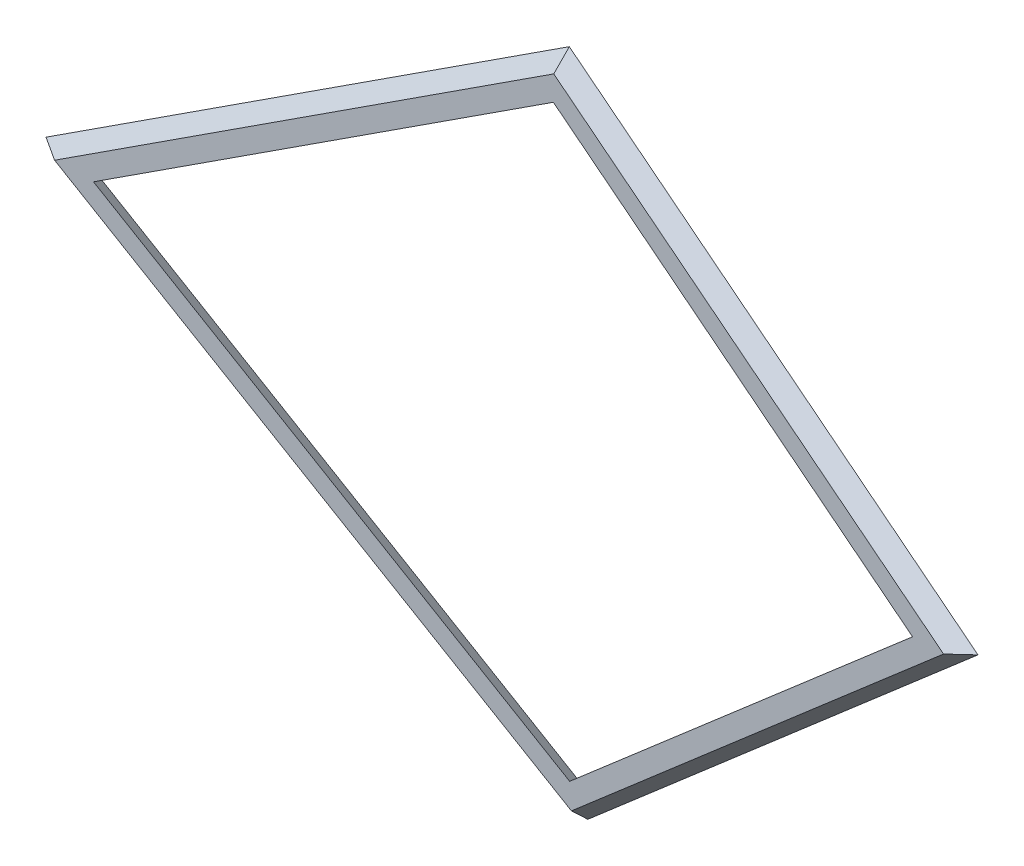
ISO-10303-21;
HEADER;
FILE_DESCRIPTION(('STEP AP214'),'2;1');
FILE_NAME('part.step','',(''),(''),'','','');
FILE_SCHEMA(('AUTOMOTIVE_DESIGN { 1 0 10303 214 1 1 1 1 }'));
ENDSEC;
DATA;
#1=APPLICATION_CONTEXT('core data for automotive mechanical design processes');
#2=APPLICATION_PROTOCOL_DEFINITION('international standard','automotive_design',2000,#1);
#3=PRODUCT_CONTEXT('',#1,'mechanical');
#4=PRODUCT('Part','Part','',(#3));
#5=PRODUCT_RELATED_PRODUCT_CATEGORY('part','',(#4));
#6=PRODUCT_DEFINITION_FORMATION('','',#4);
#7=PRODUCT_DEFINITION_CONTEXT('part definition',#1,'design');
#8=PRODUCT_DEFINITION('design','',#6,#7);
#9=PRODUCT_DEFINITION_SHAPE('','',#8);
#10=(LENGTH_UNIT() NAMED_UNIT(*) SI_UNIT(.MILLI.,.METRE.));
#11=(NAMED_UNIT(*) PLANE_ANGLE_UNIT() SI_UNIT($,.RADIAN.));
#12=(NAMED_UNIT(*) SI_UNIT($,.STERADIAN.) SOLID_ANGLE_UNIT());
#13=UNCERTAINTY_MEASURE_WITH_UNIT(LENGTH_MEASURE(1.E-05),#10,'distance_accuracy_value','');
#14=(GEOMETRIC_REPRESENTATION_CONTEXT(3) GLOBAL_UNCERTAINTY_ASSIGNED_CONTEXT((#13)) GLOBAL_UNIT_ASSIGNED_CONTEXT((#10,
#11,#12)) REPRESENTATION_CONTEXT('',''));
#15=CARTESIAN_POINT('',(0.,0.,0.));
#16=DIRECTION('',(0.,0.,1.));
#17=DIRECTION('',(1.,0.,0.));
#18=AXIS2_PLACEMENT_3D('',#15,#16,#17);
#19=CARTESIAN_POINT('',(1277.485311188,-1222.38433785116,1111.95299086095));
#20=DIRECTION('',(-8.3718556840685E-05,0.00879999570871307,-0.999961275783583));
#21=DIRECTION('',(-0.999819007396201,-0.0190248637440378,-8.37185568407934E-05));
#22=AXIS2_PLACEMENT_3D('',#19,#20,#21);
#23=PLANE('',#22);
#24=DIRECTION('',(-0.857927980202074,0.513749438132492,0.00459299520343572));
#25=VECTOR('',#24,1.);
#26=CARTESIAN_POINT('',(1253.50105292621,-1262.43334844979,1111.60255409664));
#27=LINE('',#26,#25);
#28=CARTESIAN_POINT('',(1278.33126123575,-1277.30231864556,1111.46962332588));
#29=VERTEX_POINT('',#28);
#30=CARTESIAN_POINT('',(1189.42018320766,-1224.06006820639,1111.94561684088));
#31=VERTEX_POINT('',#30);
#32=EDGE_CURVE('E279',#29,#31,#27,.T.);
#33=ORIENTED_EDGE('',*,*,#32,.T.);
#34=DIRECTION('',(0.837761664965984,0.546015542510236,0.00473498159186521));
#35=VECTOR('',#34,1.);
#36=CARTESIAN_POINT('',(1251.9947784496,-1183.27674880042,1112.29928491735));
#37=LINE('',#36,#35);
#38=CARTESIAN_POINT('',(1276.24133193064,-1167.47393087905,1112.43632506755));
#39=VERTEX_POINT('',#38);
#40=EDGE_CURVE('E48',#31,#39,#37,.T.);
#41=ORIENTED_EDGE('',*,*,#40,.T.);
#42=DIRECTION('',(0.780261658202363,-0.625428435214223,-0.0055693055929702));
#43=VECTOR('',#42,1.);
#44=CARTESIAN_POINT('',(1303.79693644232,-1189.56146834799,1112.2396403007));
#45=LINE('',#44,#43);
#46=CARTESIAN_POINT('',(1343.18588161485,-1221.13416717924,1111.95849221359));
#47=VERTEX_POINT('',#46);
#48=EDGE_CURVE('E11',#39,#47,#45,.T.);
#49=ORIENTED_EDGE('',*,*,#48,.T.);
#50=DIRECTION('',(-0.755902816253012,-0.654659045553444,-0.00569793434669476));
#51=VECTOR('',#50,1.);
#52=CARTESIAN_POINT('',(1305.02661251306,-1254.18247729538,1111.67085072664));
#53=LINE('',#52,#51);
#54=EDGE_CURVE('E62',#47,#29,#53,.T.);
#55=ORIENTED_EDGE('',*,*,#54,.T.);
#56=EDGE_LOOP('',(#33,#41,#49,#55));
#57=FACE_BOUND('',#56,.T.);
#58=DIRECTION('',(-0.755902816253012,-0.654659045553444,-0.00569793434669476));
#59=VECTOR('',#58,1.);
#60=CARTESIAN_POINT('',(1307.46839519862,-1257.00166675238,1111.64583648033));
#61=LINE('',#60,#59);
#62=CARTESIAN_POINT('',(1349.01082479404,-1221.02332836794,1111.95897995771));
#63=VERTEX_POINT('',#62);
#64=CARTESIAN_POINT('',(1278.61948575736,-1281.9866239638,1111.42837573216));
#65=VERTEX_POINT('',#64);
#66=EDGE_CURVE('E263',#63,#65,#61,.T.);
#67=ORIENTED_EDGE('',*,*,#66,.F.);
#68=DIRECTION('',(0.780261658202363,-0.625428435214223,-0.0055693055929702));
#69=VECTOR('',#68,1.);
#70=CARTESIAN_POINT('',(1306.12969734626,-1186.65142740631,1112.26505433727));
#71=LINE('',#70,#69);
#72=CARTESIAN_POINT('',(1276.35113661864,-1162.78205173852,1112.47760598974));
#73=VERTEX_POINT('',#72);
#74=EDGE_CURVE('E266',#73,#63,#71,.T.);
#75=ORIENTED_EDGE('',*,*,#74,.F.);
#76=DIRECTION('',(-0.837761664965984,-0.546015542510237,-0.00473498159186521));
#77=VECTOR('',#76,1.);
#78=CARTESIAN_POINT('',(1249.8811431059,-1180.03400831819,1112.32799908212));
#79=LINE('',#78,#77);
#80=CARTESIAN_POINT('',(1182.11795971329,-1224.19901716213,1111.9450053986));
#81=VERTEX_POINT('',#80);
#82=EDGE_CURVE('E275',#73,#81,#79,.T.);
#83=ORIENTED_EDGE('',*,*,#82,.T.);
#84=DIRECTION('',(-0.857927980202074,0.513749438132492,0.00459299520343572));
#85=VECTOR('',#84,1.);
#86=CARTESIAN_POINT('',(1251.51231552026,-1265.75415014311,1111.57349642498));
#87=LINE('',#86,#85);
#88=EDGE_CURVE('E43',#65,#81,#87,.T.);
#89=ORIENTED_EDGE('',*,*,#88,.F.);
#90=EDGE_LOOP('',(#67,#75,#83,#89));
#91=FACE_BOUND('',#90,.T.);
#92=ADVANCED_FACE('F40',(#57,#91),#23,.F.);
#93=CARTESIAN_POINT('',(1261.13154756589,-1249.89715249492,1134.67055685868));
#94=DIRECTION('',(0.398128734849398,0.670446346144006,-0.626095206361916));
#95=DIRECTION('',(-0.0131259517825785,0.68661310073075,0.726904504934937));
#96=AXIS2_PLACEMENT_3D('',#93,#94,#95);
#97=PLANE('',#96);
#98=DIRECTION('',(-0.0131259517825785,0.68661310073075,0.726904504934937));
#99=VECTOR('',#98,1.);
#100=CARTESIAN_POINT('',(1278.67411401633,-1284.84420556277,1108.4031073018));
#101=LINE('',#100,#99);
#102=CARTESIAN_POINT('',(1278.67411401633,-1284.84420556277,1108.4031073018));
#103=VERTEX_POINT('',#102);
#104=EDGE_CURVE('E225',#103,#65,#101,.T.);
#105=ORIENTED_EDGE('',*,*,#104,.T.);
#106=ORIENTED_EDGE('',*,*,#88,.T.);
#107=DIRECTION('',(0.838337489845591,0.0111553804106397,0.54503743963813));
#108=VECTOR('',#107,1.);
#109=CARTESIAN_POINT('',(1177.50315929271,-1224.26042423844,1108.94473517791));
#110=LINE('',#109,#108);
#111=CARTESIAN_POINT('',(1177.50315929271,-1224.26042423844,1108.94473517791));
#112=VERTEX_POINT('',#111);
#113=EDGE_CURVE('E268',#112,#81,#110,.T.);
#114=ORIENTED_EDGE('',*,*,#113,.F.);
#115=DIRECTION('',(0.857927980202074,-0.513749438132492,-0.00459299520343571));
#116=VECTOR('',#115,1.);
#117=CARTESIAN_POINT('',(1278.67411401633,-1284.84420556277,1108.4031073018));
#118=LINE('',#117,#116);
#119=EDGE_CURVE('E198',#112,#103,#118,.T.);
#120=ORIENTED_EDGE('',*,*,#119,.T.);
#121=EDGE_LOOP('',(#105,#106,#114,#120));
#122=FACE_BOUND('',#121,.T.);
#123=ADVANCED_FACE('F234',(#122),#97,.F.);
#124=CARTESIAN_POINT('',(1297.82411249905,-1246.04034324945,1131.69009532328));
#125=DIRECTION('',(-0.526645652021521,0.613216168553052,-0.588736178463615));
#126=DIRECTION('',(-0.0131259517825785,0.68661310073075,0.726904504934937));
#127=AXIS2_PLACEMENT_3D('',#124,#125,#126);
#128=PLANE('',#127);
#129=DIRECTION('',(-0.755497478815554,-0.0201402677605156,0.654841911546502));
#130=VECTOR('',#129,1.);
#131=CARTESIAN_POINT('',(1352.47148558704,-1220.93107308323,1108.95938592536));
#132=LINE('',#131,#130);
#133=CARTESIAN_POINT('',(1352.47148558704,-1220.93107308323,1108.95938592536));
#134=VERTEX_POINT('',#133);
#135=EDGE_CURVE('E228',#134,#63,#132,.T.);
#136=ORIENTED_EDGE('',*,*,#135,.T.);
#137=ORIENTED_EDGE('',*,*,#66,.T.);
#138=ORIENTED_EDGE('',*,*,#104,.F.);
#139=DIRECTION('',(0.755902816253012,0.654659045553444,0.00569793434669476));
#140=VECTOR('',#139,1.);
#141=CARTESIAN_POINT('',(1352.47148558704,-1220.93107308323,1108.95938592536));
#142=LINE('',#141,#140);
#143=EDGE_CURVE('E135',#103,#134,#142,.T.);
#144=ORIENTED_EDGE('',*,*,#143,.T.);
#145=EDGE_LOOP('',(#136,#137,#138,#144));
#146=FACE_BOUND('',#145,.T.);
#147=ADVANCED_FACE('F158',(#146),#128,.F.);
#148=CARTESIAN_POINT('',(1262.32593377044,-1247.88581345649,1132.7922712396));
#149=DIRECTION('',(0.398128734849398,0.670446346144006,-0.626095206361916));
#150=DIRECTION('',(-0.0131259517825785,0.68661310073075,0.726904504934937));
#151=AXIS2_PLACEMENT_3D('',#148,#149,#150);
#152=PLANE('',#151);
#153=ORIENTED_EDGE('',*,*,#32,.F.);
#154=DIRECTION('',(-0.0131259517825785,0.68661310073075,0.726904504934937));
#155=VECTOR('',#154,1.);
#156=CARTESIAN_POINT('',(1277.85994280457,-1252.64784673927,1137.57085366419));
#157=LINE('',#156,#155);
#158=CARTESIAN_POINT('',(1278.38588949473,-1280.15990024453,1108.44435489552));
#159=VERTEX_POINT('',#158);
#160=EDGE_CURVE('E119',#159,#29,#157,.T.);
#161=ORIENTED_EDGE('',*,*,#160,.F.);
#162=DIRECTION('',(0.857927980202074,-0.513749438132492,-0.00459299520343572));
#163=VECTOR('',#162,1.);
#164=CARTESIAN_POINT('',(1252.24404391565,-1264.50548776711,1108.58430763529));
#165=LINE('',#164,#163);
#166=CARTESIAN_POINT('',(1184.80538278708,-1224.1214752827,1108.94534662019));
#167=VERTEX_POINT('',#166);
#168=EDGE_CURVE('E115',#167,#159,#165,.T.);
#169=ORIENTED_EDGE('',*,*,#168,.F.);
#170=DIRECTION('',(0.838337489845591,0.0111553804106396,0.54503743963813));
#171=VECTOR('',#170,1.);
#172=CARTESIAN_POINT('',(1249.96160177756,-1223.25447074364,1151.30606554929));
#173=LINE('',#172,#171);
#174=EDGE_CURVE('E110',#167,#31,#173,.T.);
#175=ORIENTED_EDGE('',*,*,#174,.T.);
#176=EDGE_LOOP('',(#153,#161,#169,#175));
#177=FACE_BOUND('',#176,.T.);
#178=ADVANCED_FACE('F155',(#177),#152,.T.);
#179=CARTESIAN_POINT('',(1296.24417554298,-1244.20069474379,1129.92388678789));
#180=DIRECTION('',(-0.526645652021521,0.613216168553052,-0.588736178463615));
#181=DIRECTION('',(-0.0131259517825785,0.68661310073075,0.726904504934937));
#182=AXIS2_PLACEMENT_3D('',#179,#180,#181);
#183=PLANE('',#182);
#184=ORIENTED_EDGE('',*,*,#54,.F.);
#185=DIRECTION('',(-0.755497478815554,-0.0201402677605156,0.654841911546502));
#186=VECTOR('',#185,1.);
#187=CARTESIAN_POINT('',(1307.15363819288,-1222.09472502474,1143.19012940813));
#188=LINE('',#187,#186);
#189=CARTESIAN_POINT('',(1346.64654240786,-1221.04191189454,1108.95889818125));
#190=VERTEX_POINT('',#189);
#191=EDGE_CURVE('E126',#190,#47,#188,.T.);
#192=ORIENTED_EDGE('',*,*,#191,.F.);
#193=DIRECTION('',(0.755902816253012,0.654659045553444,0.00569793434669476));
#194=VECTOR('',#193,1.);
#195=CARTESIAN_POINT('',(1306.477155745,-1255.83110935186,1108.65610459055));
#196=LINE('',#195,#194);
#197=EDGE_CURVE('E125',#159,#190,#196,.T.);
#198=ORIENTED_EDGE('',*,*,#197,.F.);
#199=ORIENTED_EDGE('',*,*,#160,.T.);
#200=EDGE_LOOP('',(#184,#192,#198,#199));
#201=FACE_BOUND('',#200,.T.);
#202=ADVANCED_FACE('F154',(#201),#183,.T.);
#203=CARTESIAN_POINT('',(1260.10436750991,-1195.9175613101,1135.14568142233));
#204=DIRECTION('',(-0.423135588697556,0.643694966935379,0.637662185737585));
#205=DIRECTION('',(0.0132466459904118,-0.69929975648642,0.714705797477562));
#206=AXIS2_PLACEMENT_3D('',#203,#204,#205);
#207=PLANE('',#206);
#208=ORIENTED_EDGE('',*,*,#82,.F.);
#209=DIRECTION('',(0.013246645990412,-0.69929975648642,0.714705797477562));
#210=VECTOR('',#209,1.);
#211=CARTESIAN_POINT('',(1276.29600604833,-1159.8716701653,1109.50310676539));
#212=LINE('',#211,#210);
#213=CARTESIAN_POINT('',(1276.29600604833,-1159.8716701653,1109.50310676539));
#214=VERTEX_POINT('',#213);
#215=EDGE_CURVE('E229',#214,#73,#212,.T.);
#216=ORIENTED_EDGE('',*,*,#215,.F.);
#217=DIRECTION('',(-0.837761664965984,-0.546015542510236,-0.00473498159186521));
#218=VECTOR('',#217,1.);
#219=CARTESIAN_POINT('',(1177.50315929271,-1224.26042423844,1108.94473517791));
#220=LINE('',#219,#218);
#221=EDGE_CURVE('E140',#214,#112,#220,.T.);
#222=ORIENTED_EDGE('',*,*,#221,.T.);
#223=ORIENTED_EDGE('',*,*,#113,.T.);
#224=EDGE_LOOP('',(#208,#216,#222,#223));
#225=FACE_BOUND('',#224,.T.);
#226=ADVANCED_FACE('F145',(#225),#207,.T.);
#227=CARTESIAN_POINT('',(1277.48506003233,-1222.35793786404,1108.9531070336));
#228=DIRECTION('',(8.37185568406849E-05,-0.00879999570871307,0.999961275783582));
#229=DIRECTION('',(0.999819007396201,0.0190248637440378,8.37185568407934E-05));
#230=AXIS2_PLACEMENT_3D('',#227,#228,#229);
#231=PLANE('',#230);
#232=ORIENTED_EDGE('',*,*,#168,.T.);
#233=ORIENTED_EDGE('',*,*,#197,.T.);
#234=DIRECTION('',(-0.780261658202363,0.625428435214223,0.0055693055929702));
#235=VECTOR('',#234,1.);
#236=CARTESIAN_POINT('',(1305.18270397173,-1187.80605656515,1109.25485631898));
#237=LINE('',#236,#235);
#238=CARTESIAN_POINT('',(1276.18620136033,-1164.56354930583,1109.46182584321));
#239=VERTEX_POINT('',#238);
#240=EDGE_CURVE('E116',#190,#239,#237,.T.);
#241=ORIENTED_EDGE('',*,*,#240,.T.);
#242=DIRECTION('',(-0.837761664965984,-0.546015542510236,-0.00473498159186521));
#243=VECTOR('',#242,1.);
#244=CARTESIAN_POINT('',(1250.65884174157,-1181.20113931976,1109.31754664909));
#245=LINE('',#244,#243);
#246=EDGE_CURVE('E106',#239,#167,#245,.T.);
#247=ORIENTED_EDGE('',*,*,#246,.T.);
#248=EDGE_LOOP('',(#232,#233,#241,#247));
#249=FACE_BOUND('',#248,.T.);
#250=ORIENTED_EDGE('',*,*,#143,.F.);
#251=ORIENTED_EDGE('',*,*,#119,.F.);
#252=ORIENTED_EDGE('',*,*,#221,.F.);
#253=DIRECTION('',(-0.780261658202363,0.625428435214223,0.0055693055929702));
#254=VECTOR('',#253,1.);
#255=CARTESIAN_POINT('',(1276.29600604833,-1159.8716701653,1109.50310676539));
#256=LINE('',#255,#254);
#257=EDGE_CURVE('E204',#134,#214,#256,.T.);
#258=ORIENTED_EDGE('',*,*,#257,.F.);
#259=EDGE_LOOP('',(#250,#251,#252,#258));
#260=FACE_BOUND('',#259,.T.);
#261=ADVANCED_FACE('F122',(#249,#260),#231,.F.);
#262=CARTESIAN_POINT('',(1296.916091357,-1198.3227013919,1132.11010264953));
#263=DIRECTION('',(-0.503133967434248,-0.622352137793649,-0.599611563762364));
#264=DIRECTION('',(-0.0132466459904118,0.69929975648642,-0.714705797477563));
#265=AXIS2_PLACEMENT_3D('',#262,#263,#264);
#266=PLANE('',#265);
#267=ORIENTED_EDGE('',*,*,#215,.T.);
#268=ORIENTED_EDGE('',*,*,#74,.T.);
#269=ORIENTED_EDGE('',*,*,#135,.F.);
#270=ORIENTED_EDGE('',*,*,#257,.T.);
#271=EDGE_LOOP('',(#267,#268,#269,#270));
#272=FACE_BOUND('',#271,.T.);
#273=ADVANCED_FACE('F162',(#272),#266,.F.);
#274=CARTESIAN_POINT('',(1261.373774276,-1197.84864621091,1133.23269486511));
#275=DIRECTION('',(0.423135588697556,-0.643694966935379,-0.637662185737585));
#276=DIRECTION('',(-0.0132466459904118,0.69929975648642,-0.714705797477562));
#277=AXIS2_PLACEMENT_3D('',#274,#275,#276);
#278=PLANE('',#277);
#279=ORIENTED_EDGE('',*,*,#40,.F.);
#280=ORIENTED_EDGE('',*,*,#174,.F.);
#281=ORIENTED_EDGE('',*,*,#246,.F.);
#282=DIRECTION('',(0.0132466459904121,-0.69929975648642,0.714705797477562));
#283=VECTOR('',#282,1.);
#284=CARTESIAN_POINT('',(1276.71698417363,-1192.58394725075,1138.09953188144));
#285=LINE('',#284,#283);
#286=EDGE_CURVE('E108',#239,#39,#285,.T.);
#287=ORIENTED_EDGE('',*,*,#286,.T.);
#288=EDGE_LOOP('',(#279,#280,#281,#287));
#289=FACE_BOUND('',#288,.T.);
#290=ADVANCED_FACE('F107',(#289),#278,.T.);
#291=CARTESIAN_POINT('',(1295.4066894547,-1200.18975780528,1130.31126795825));
#292=DIRECTION('',(-0.503133967434248,-0.622352137793649,-0.599611563762364));
#293=DIRECTION('',(-0.0132466459904118,0.69929975648642,-0.714705797477563));
#294=AXIS2_PLACEMENT_3D('',#291,#292,#293);
#295=PLANE('',#294);
#296=ORIENTED_EDGE('',*,*,#48,.F.);
#297=ORIENTED_EDGE('',*,*,#286,.F.);
#298=ORIENTED_EDGE('',*,*,#240,.F.);
#299=ORIENTED_EDGE('',*,*,#191,.T.);
#300=EDGE_LOOP('',(#296,#297,#298,#299));
#301=FACE_BOUND('',#300,.T.);
#302=ADVANCED_FACE('F118',(#301),#295,.T.);
#303=CLOSED_SHELL('',(#92,#123,#147,#178,#202,#226,#261,#273,#290,#302));
#304=MANIFOLD_SOLID_BREP('B2',#303);
#305=ADVANCED_BREP_SHAPE_REPRESENTATION('',(#18,#304),#14);
#306=SHAPE_DEFINITION_REPRESENTATION(#9,#305);
ENDSEC;
END-ISO-10303-21;
